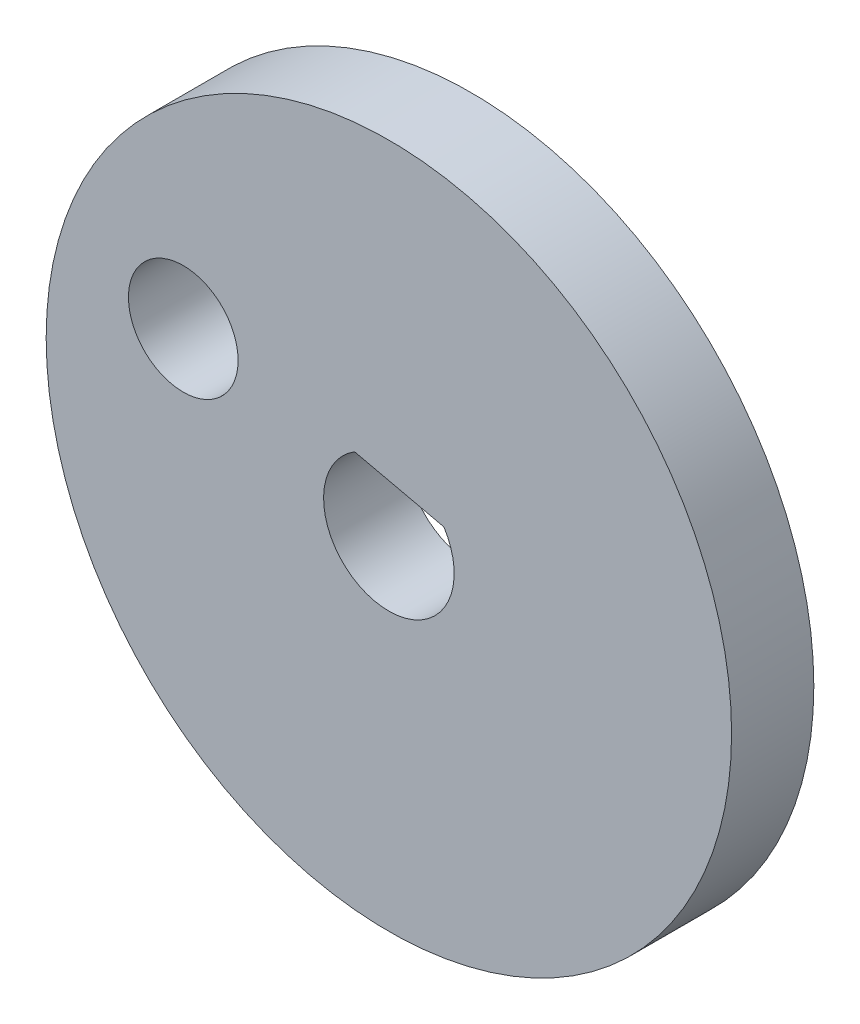
ISO-10303-21;
HEADER;
FILE_DESCRIPTION(('STEP AP214'),'2;1');
FILE_NAME('part.step','',(''),(''),'','','');
FILE_SCHEMA(('AUTOMOTIVE_DESIGN { 1 0 10303 214 1 1 1 1 }'));
ENDSEC;
DATA;
#1=APPLICATION_CONTEXT('core data for automotive mechanical design processes');
#2=APPLICATION_PROTOCOL_DEFINITION('international standard','automotive_design',2000,#1);
#3=PRODUCT_CONTEXT('',#1,'mechanical');
#4=PRODUCT('Part','Part','',(#3));
#5=PRODUCT_RELATED_PRODUCT_CATEGORY('part','',(#4));
#6=PRODUCT_DEFINITION_FORMATION('','',#4);
#7=PRODUCT_DEFINITION_CONTEXT('part definition',#1,'design');
#8=PRODUCT_DEFINITION('design','',#6,#7);
#9=PRODUCT_DEFINITION_SHAPE('','',#8);
#10=(LENGTH_UNIT() NAMED_UNIT(*) SI_UNIT(.MILLI.,.METRE.));
#11=(NAMED_UNIT(*) PLANE_ANGLE_UNIT() SI_UNIT($,.RADIAN.));
#12=(NAMED_UNIT(*) SI_UNIT($,.STERADIAN.) SOLID_ANGLE_UNIT());
#13=UNCERTAINTY_MEASURE_WITH_UNIT(LENGTH_MEASURE(1.E-05),#10,'distance_accuracy_value','');
#14=(GEOMETRIC_REPRESENTATION_CONTEXT(3) GLOBAL_UNCERTAINTY_ASSIGNED_CONTEXT((#13)) GLOBAL_UNIT_ASSIGNED_CONTEXT((#10,
#11,#12)) REPRESENTATION_CONTEXT('',''));
#15=CARTESIAN_POINT('',(0.,0.,0.));
#16=DIRECTION('',(0.,0.,1.));
#17=DIRECTION('',(1.,0.,0.));
#18=AXIS2_PLACEMENT_3D('',#15,#16,#17);
#19=CARTESIAN_POINT('',(0.,0.,3.));
#20=DIRECTION('',(0.,0.,-1.));
#21=DIRECTION('',(-1.,0.,0.));
#22=AXIS2_PLACEMENT_3D('',#19,#20,#21);
#23=CYLINDRICAL_SURFACE('',#22,12.5);
#24=CARTESIAN_POINT('',(0.,0.,3.));
#25=DIRECTION('',(0.,0.,1.));
#26=DIRECTION('',(1.,0.,0.));
#27=AXIS2_PLACEMENT_3D('',#24,#25,#26);
#28=CIRCLE('',#27,12.5);
#29=CARTESIAN_POINT('',(12.5,0.,3.));
#30=VERTEX_POINT('',#29);
#31=EDGE_CURVE('E11',#30,#30,#28,.T.);
#32=ORIENTED_EDGE('',*,*,#31,.F.);
#33=EDGE_LOOP('',(#32));
#34=FACE_BOUND('',#33,.T.);
#35=CARTESIAN_POINT('',(0.,0.,0.));
#36=DIRECTION('',(0.,0.,1.));
#37=DIRECTION('',(1.,0.,0.));
#38=AXIS2_PLACEMENT_3D('',#35,#36,#37);
#39=CIRCLE('',#38,12.5);
#40=CARTESIAN_POINT('',(12.5,0.,0.));
#41=VERTEX_POINT('',#40);
#42=EDGE_CURVE('E36',#41,#41,#39,.T.);
#43=ORIENTED_EDGE('',*,*,#42,.T.);
#44=EDGE_LOOP('',(#43));
#45=FACE_BOUND('',#44,.T.);
#46=ADVANCED_FACE('F33',(#34,#45),#23,.T.);
#47=CARTESIAN_POINT('',(0.,0.,3.));
#48=DIRECTION('',(0.,0.,1.));
#49=DIRECTION('',(1.,0.,0.));
#50=AXIS2_PLACEMENT_3D('',#47,#48,#49);
#51=PLANE('',#50);
#52=CARTESIAN_POINT('',(-7.49915042857934,2.78616992474227,3.));
#53=DIRECTION('',(0.,0.,1.));
#54=DIRECTION('',(1.,0.,0.));
#55=AXIS2_PLACEMENT_3D('',#52,#53,#54);
#56=CIRCLE('',#55,2.);
#57=CARTESIAN_POINT('',(-5.49915042857934,2.78616992474227,3.));
#58=VERTEX_POINT('',#57);
#59=EDGE_CURVE('E75',#58,#58,#56,.T.);
#60=ORIENTED_EDGE('',*,*,#59,.F.);
#61=EDGE_LOOP('',(#60));
#62=FACE_BOUND('',#61,.T.);
#63=CARTESIAN_POINT('',(0.,0.,3.));
#64=DIRECTION('',(0.,0.,1.));
#65=DIRECTION('',(1.,0.,0.));
#66=AXIS2_PLACEMENT_3D('',#63,#64,#65);
#67=CIRCLE('',#66,2.38125);
#68=CARTESIAN_POINT('',(-1.24923869858208,2.02725287925926,3.));
#69=VERTEX_POINT('',#68);
#70=CARTESIAN_POINT('',(2.00666826094724,1.2820429216711,3.));
#71=VERTEX_POINT('',#70);
#72=EDGE_CURVE('E47',#69,#71,#67,.T.);
#73=ORIENTED_EDGE('',*,*,#72,.F.);
#74=DIRECTION('',(0.974793257545978,-0.223110073826579,0.));
#75=VECTOR('',#74,1.);
#76=CARTESIAN_POINT('',(-1.24923869858208,2.02725287925926,3.));
#77=LINE('',#76,#75);
#78=EDGE_CURVE('E66',#69,#71,#77,.T.);
#79=ORIENTED_EDGE('',*,*,#78,.T.);
#80=EDGE_LOOP('',(#73,#79));
#81=FACE_BOUND('',#80,.T.);
#82=ORIENTED_EDGE('',*,*,#31,.T.);
#83=EDGE_LOOP('',(#82));
#84=FACE_BOUND('',#83,.T.);
#85=ADVANCED_FACE('F70',(#62,#81,#84),#51,.T.);
#86=CARTESIAN_POINT('',(0.,0.,0.));
#87=DIRECTION('',(0.,0.,1.));
#88=DIRECTION('',(1.,0.,0.));
#89=AXIS2_PLACEMENT_3D('',#86,#87,#88);
#90=PLANE('',#89);
#91=CARTESIAN_POINT('',(-7.49915042857934,2.78616992474227,0.));
#92=DIRECTION('',(0.,0.,1.));
#93=DIRECTION('',(1.,0.,0.));
#94=AXIS2_PLACEMENT_3D('',#91,#92,#93);
#95=CIRCLE('',#94,2.);
#96=CARTESIAN_POINT('',(-5.49915042857934,2.78616992474227,0.));
#97=VERTEX_POINT('',#96);
#98=EDGE_CURVE('E72',#97,#97,#95,.T.);
#99=ORIENTED_EDGE('',*,*,#98,.T.);
#100=EDGE_LOOP('',(#99));
#101=FACE_BOUND('',#100,.T.);
#102=DIRECTION('',(0.974793257545978,-0.223110073826579,0.));
#103=VECTOR('',#102,1.);
#104=CARTESIAN_POINT('',(-1.24923869858208,2.02725287925926,0.));
#105=LINE('',#104,#103);
#106=CARTESIAN_POINT('',(-1.24923869858208,2.02725287925926,0.));
#107=VERTEX_POINT('',#106);
#108=CARTESIAN_POINT('',(2.00666826094724,1.2820429216711,0.));
#109=VERTEX_POINT('',#108);
#110=EDGE_CURVE('E78',#107,#109,#105,.T.);
#111=ORIENTED_EDGE('',*,*,#110,.F.);
#112=CARTESIAN_POINT('',(0.,0.,0.));
#113=DIRECTION('',(0.,0.,1.));
#114=DIRECTION('',(1.,0.,0.));
#115=AXIS2_PLACEMENT_3D('',#112,#113,#114);
#116=CIRCLE('',#115,2.38125);
#117=EDGE_CURVE('E52',#107,#109,#116,.T.);
#118=ORIENTED_EDGE('',*,*,#117,.T.);
#119=EDGE_LOOP('',(#111,#118));
#120=FACE_BOUND('',#119,.T.);
#121=ORIENTED_EDGE('',*,*,#42,.F.);
#122=EDGE_LOOP('',(#121));
#123=FACE_BOUND('',#122,.T.);
#124=ADVANCED_FACE('F89',(#101,#120,#123),#90,.F.);
#125=CARTESIAN_POINT('',(0.,0.,0.));
#126=DIRECTION('',(0.,0.,1.));
#127=DIRECTION('',(1.,0.,0.));
#128=AXIS2_PLACEMENT_3D('',#125,#126,#127);
#129=CYLINDRICAL_SURFACE('',#128,2.38125);
#130=ORIENTED_EDGE('',*,*,#72,.T.);
#131=DIRECTION('',(0.,0.,1.));
#132=VECTOR('',#131,1.);
#133=CARTESIAN_POINT('',(2.00666826094724,1.2820429216711,0.));
#134=LINE('',#133,#132);
#135=EDGE_CURVE('E63',#109,#71,#134,.T.);
#136=ORIENTED_EDGE('',*,*,#135,.F.);
#137=ORIENTED_EDGE('',*,*,#117,.F.);
#138=DIRECTION('',(0.,0.,1.));
#139=VECTOR('',#138,1.);
#140=CARTESIAN_POINT('',(-1.24923869858208,2.02725287925926,0.));
#141=LINE('',#140,#139);
#142=EDGE_CURVE('E58',#107,#69,#141,.T.);
#143=ORIENTED_EDGE('',*,*,#142,.T.);
#144=EDGE_LOOP('',(#130,#136,#137,#143));
#145=FACE_BOUND('',#144,.T.);
#146=ADVANCED_FACE('F60',(#145),#129,.F.);
#147=CARTESIAN_POINT('',(-1.24923869858208,2.02725287925926,0.));
#148=DIRECTION('',(-0.223110073826579,-0.974793257545978,0.));
#149=DIRECTION('',(0.974793257545978,-0.223110073826579,0.));
#150=AXIS2_PLACEMENT_3D('',#147,#148,#149);
#151=PLANE('',#150);
#152=ORIENTED_EDGE('',*,*,#78,.F.);
#153=ORIENTED_EDGE('',*,*,#142,.F.);
#154=ORIENTED_EDGE('',*,*,#110,.T.);
#155=ORIENTED_EDGE('',*,*,#135,.T.);
#156=EDGE_LOOP('',(#152,#153,#154,#155));
#157=FACE_BOUND('',#156,.T.);
#158=ADVANCED_FACE('F67',(#157),#151,.T.);
#159=CARTESIAN_POINT('',(-7.49915042857934,2.78616992474227,0.));
#160=DIRECTION('',(0.,0.,1.));
#161=DIRECTION('',(1.,0.,0.));
#162=AXIS2_PLACEMENT_3D('',#159,#160,#161);
#163=CYLINDRICAL_SURFACE('',#162,2.);
#164=ORIENTED_EDGE('',*,*,#98,.F.);
#165=EDGE_LOOP('',(#164));
#166=FACE_BOUND('',#165,.T.);
#167=ORIENTED_EDGE('',*,*,#59,.T.);
#168=EDGE_LOOP('',(#167));
#169=FACE_BOUND('',#168,.T.);
#170=ADVANCED_FACE('F86',(#166,#169),#163,.F.);
#171=CLOSED_SHELL('',(#46,#85,#124,#146,#158,#170));
#172=MANIFOLD_SOLID_BREP('B2',#171);
#173=ADVANCED_BREP_SHAPE_REPRESENTATION('',(#18,#172),#14);
#174=SHAPE_DEFINITION_REPRESENTATION(#9,#173);
ENDSEC;
END-ISO-10303-21;
